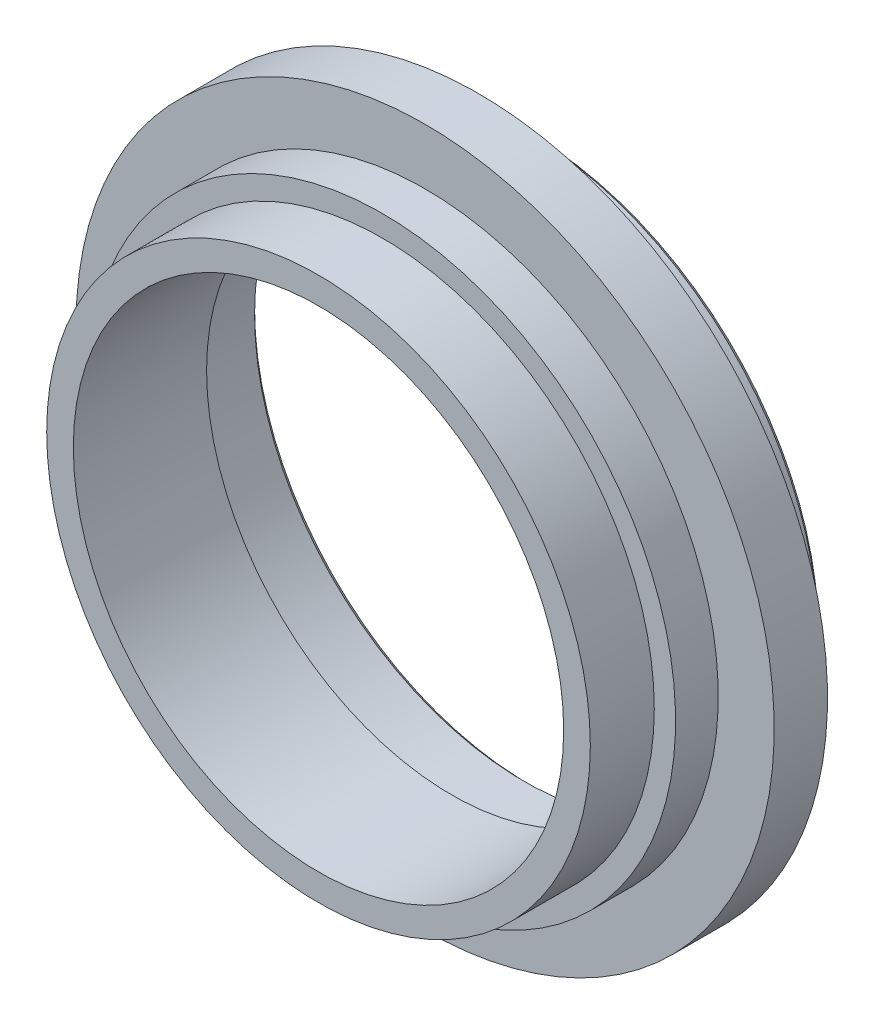
ISO-10303-21;
HEADER;
FILE_DESCRIPTION(('STEP AP214'),'2;1');
FILE_NAME('part.step','',(''),(''),'','','');
FILE_SCHEMA(('AUTOMOTIVE_DESIGN { 1 0 10303 214 1 1 1 1 }'));
ENDSEC;
DATA;
#1=APPLICATION_CONTEXT('core data for automotive mechanical design processes');
#2=APPLICATION_PROTOCOL_DEFINITION('international standard','automotive_design',2000,#1);
#3=PRODUCT_CONTEXT('',#1,'mechanical');
#4=PRODUCT('Part','Part','',(#3));
#5=PRODUCT_RELATED_PRODUCT_CATEGORY('part','',(#4));
#6=PRODUCT_DEFINITION_FORMATION('','',#4);
#7=PRODUCT_DEFINITION_CONTEXT('part definition',#1,'design');
#8=PRODUCT_DEFINITION('design','',#6,#7);
#9=PRODUCT_DEFINITION_SHAPE('','',#8);
#10=(LENGTH_UNIT() NAMED_UNIT(*) SI_UNIT(.MILLI.,.METRE.));
#11=(NAMED_UNIT(*) PLANE_ANGLE_UNIT() SI_UNIT($,.RADIAN.));
#12=(NAMED_UNIT(*) SI_UNIT($,.STERADIAN.) SOLID_ANGLE_UNIT());
#13=UNCERTAINTY_MEASURE_WITH_UNIT(LENGTH_MEASURE(1.E-05),#10,'distance_accuracy_value','');
#14=(GEOMETRIC_REPRESENTATION_CONTEXT(3) GLOBAL_UNCERTAINTY_ASSIGNED_CONTEXT((#13)) GLOBAL_UNIT_ASSIGNED_CONTEXT((#10,
#11,#12)) REPRESENTATION_CONTEXT('',''));
#15=CARTESIAN_POINT('',(0.,0.,0.));
#16=DIRECTION('',(0.,0.,1.));
#17=DIRECTION('',(1.,0.,0.));
#18=AXIS2_PLACEMENT_3D('',#15,#16,#17);
#19=CARTESIAN_POINT('',(0.,0.,-99.29791666667));
#20=DIRECTION('',(0.,0.,-1.));
#21=DIRECTION('',(-1.,0.,0.));
#22=AXIS2_PLACEMENT_3D('',#19,#20,#21);
#23=CYLINDRICAL_SURFACE('',#22,25.3);
#24=CARTESIAN_POINT('',(0.,0.,-19.3));
#25=DIRECTION('',(0.,0.,1.));
#26=DIRECTION('',(1.,0.,0.));
#27=AXIS2_PLACEMENT_3D('',#24,#25,#26);
#28=CIRCLE('',#27,25.3);
#29=CARTESIAN_POINT('',(25.3,0.,-19.3));
#30=VERTEX_POINT('',#29);
#31=EDGE_CURVE('E10',#30,#30,#28,.F.);
#32=ORIENTED_EDGE('',*,*,#31,.T.);
#33=EDGE_LOOP('',(#32));
#34=FACE_BOUND('',#33,.T.);
#35=CARTESIAN_POINT('',(0.,0.,-12.5));
#36=DIRECTION('',(0.,0.,-1.));
#37=DIRECTION('',(-1.,0.,0.));
#38=AXIS2_PLACEMENT_3D('',#35,#36,#37);
#39=CIRCLE('',#38,25.3);
#40=CARTESIAN_POINT('',(-25.3,0.,-12.5));
#41=VERTEX_POINT('',#40);
#42=EDGE_CURVE('E84',#41,#41,#39,.T.);
#43=ORIENTED_EDGE('',*,*,#42,.F.);
#44=EDGE_LOOP('',(#43));
#45=FACE_BOUND('',#44,.T.);
#46=ADVANCED_FACE('F37',(#34,#45),#23,.F.);
#47=CARTESIAN_POINT('',(25.3,0.,-19.8));
#48=DIRECTION('',(0.,0.,1.));
#49=DIRECTION('',(1.,0.,0.));
#50=AXIS2_PLACEMENT_3D('',#47,#48,#49);
#51=PLANE('',#50);
#52=CARTESIAN_POINT('',(0.,0.,-19.8));
#53=DIRECTION('',(0.,0.,1.));
#54=DIRECTION('',(1.,0.,0.));
#55=AXIS2_PLACEMENT_3D('',#52,#53,#54);
#56=CIRCLE('',#55,27.1);
#57=CARTESIAN_POINT('',(27.1,0.,-19.8));
#58=VERTEX_POINT('',#57);
#59=EDGE_CURVE('E48',#58,#58,#56,.F.);
#60=ORIENTED_EDGE('',*,*,#59,.T.);
#61=EDGE_LOOP('',(#60));
#62=FACE_BOUND('',#61,.T.);
#63=CARTESIAN_POINT('',(0.,0.,-19.8));
#64=DIRECTION('',(0.,0.,1.));
#65=DIRECTION('',(1.,0.,0.));
#66=AXIS2_PLACEMENT_3D('',#63,#64,#65);
#67=CIRCLE('',#66,25.8);
#68=CARTESIAN_POINT('',(25.8,0.,-19.8));
#69=VERTEX_POINT('',#68);
#70=EDGE_CURVE('E52',#69,#69,#67,.T.);
#71=ORIENTED_EDGE('',*,*,#70,.T.);
#72=EDGE_LOOP('',(#71));
#73=FACE_BOUND('',#72,.T.);
#74=ADVANCED_FACE('F91',(#62,#73),#51,.F.);
#75=CARTESIAN_POINT('',(0.,0.,-99.29791666667));
#76=DIRECTION('',(0.,0.,-1.));
#77=DIRECTION('',(-1.,0.,0.));
#78=AXIS2_PLACEMENT_3D('',#75,#76,#77);
#79=CYLINDRICAL_SURFACE('',#78,27.6);
#80=CARTESIAN_POINT('',(0.,0.,-19.3));
#81=DIRECTION('',(0.,0.,1.));
#82=DIRECTION('',(1.,0.,0.));
#83=AXIS2_PLACEMENT_3D('',#80,#81,#82);
#84=CIRCLE('',#83,27.6);
#85=CARTESIAN_POINT('',(27.6,0.,-19.3));
#86=VERTEX_POINT('',#85);
#87=EDGE_CURVE('E44',#86,#86,#84,.T.);
#88=ORIENTED_EDGE('',*,*,#87,.T.);
#89=EDGE_LOOP('',(#88));
#90=FACE_BOUND('',#89,.T.);
#91=CARTESIAN_POINT('',(0.,0.,-15.));
#92=DIRECTION('',(0.,0.,-1.));
#93=DIRECTION('',(-1.,0.,0.));
#94=AXIS2_PLACEMENT_3D('',#91,#92,#93);
#95=CIRCLE('',#94,27.6);
#96=CARTESIAN_POINT('',(-27.6,0.,-15.));
#97=VERTEX_POINT('',#96);
#98=EDGE_CURVE('E57',#97,#97,#95,.T.);
#99=ORIENTED_EDGE('',*,*,#98,.T.);
#100=EDGE_LOOP('',(#99));
#101=FACE_BOUND('',#100,.T.);
#102=ADVANCED_FACE('F96',(#90,#101),#79,.T.);
#103=CARTESIAN_POINT('',(27.6,0.,-15.));
#104=DIRECTION('',(0.,0.,1.));
#105=DIRECTION('',(1.,0.,0.));
#106=AXIS2_PLACEMENT_3D('',#103,#104,#105);
#107=PLANE('',#106);
#108=ORIENTED_EDGE('',*,*,#98,.F.);
#109=EDGE_LOOP('',(#108));
#110=FACE_BOUND('',#109,.T.);
#111=CARTESIAN_POINT('',(0.,0.,-15.));
#112=DIRECTION('',(0.,0.,-1.));
#113=DIRECTION('',(-1.,0.,0.));
#114=AXIS2_PLACEMENT_3D('',#111,#112,#113);
#115=CIRCLE('',#114,32.75);
#116=CARTESIAN_POINT('',(-32.75,0.,-15.));
#117=VERTEX_POINT('',#116);
#118=EDGE_CURVE('E60',#117,#117,#115,.T.);
#119=ORIENTED_EDGE('',*,*,#118,.T.);
#120=EDGE_LOOP('',(#119));
#121=FACE_BOUND('',#120,.T.);
#122=ADVANCED_FACE('F146',(#110,#121),#107,.F.);
#123=CARTESIAN_POINT('',(0.,0.,-99.29791666667));
#124=DIRECTION('',(0.,0.,-1.));
#125=DIRECTION('',(-1.,0.,0.));
#126=AXIS2_PLACEMENT_3D('',#123,#124,#125);
#127=CYLINDRICAL_SURFACE('',#126,32.75);
#128=ORIENTED_EDGE('',*,*,#118,.F.);
#129=EDGE_LOOP('',(#128));
#130=FACE_BOUND('',#129,.T.);
#131=CARTESIAN_POINT('',(0.,0.,-10.));
#132=DIRECTION('',(0.,0.,-1.));
#133=DIRECTION('',(-1.,0.,0.));
#134=AXIS2_PLACEMENT_3D('',#131,#132,#133);
#135=CIRCLE('',#134,32.75);
#136=CARTESIAN_POINT('',(-32.75,0.,-10.));
#137=VERTEX_POINT('',#136);
#138=EDGE_CURVE('E63',#137,#137,#135,.T.);
#139=ORIENTED_EDGE('',*,*,#138,.T.);
#140=EDGE_LOOP('',(#139));
#141=FACE_BOUND('',#140,.T.);
#142=ADVANCED_FACE('F142',(#130,#141),#127,.T.);
#143=CARTESIAN_POINT('',(32.75,0.,-10.));
#144=DIRECTION('',(0.,0.,-1.));
#145=DIRECTION('',(-1.,0.,0.));
#146=AXIS2_PLACEMENT_3D('',#143,#144,#145);
#147=PLANE('',#146);
#148=ORIENTED_EDGE('',*,*,#138,.F.);
#149=EDGE_LOOP('',(#148));
#150=FACE_BOUND('',#149,.T.);
#151=CARTESIAN_POINT('',(0.,0.,-9.99999999999999));
#152=DIRECTION('',(0.,0.,-1.));
#153=DIRECTION('',(-1.,0.,0.));
#154=AXIS2_PLACEMENT_3D('',#151,#152,#153);
#155=CIRCLE('',#154,27.5);
#156=CARTESIAN_POINT('',(-27.5,0.,-9.99999999999999));
#157=VERTEX_POINT('',#156);
#158=EDGE_CURVE('E66',#157,#157,#155,.T.);
#159=ORIENTED_EDGE('',*,*,#158,.T.);
#160=EDGE_LOOP('',(#159));
#161=FACE_BOUND('',#160,.T.);
#162=ADVANCED_FACE('F138',(#150,#161),#147,.F.);
#163=CARTESIAN_POINT('',(0.,0.,-99.29791666667));
#164=DIRECTION('',(0.,0.,-1.));
#165=DIRECTION('',(-1.,0.,0.));
#166=AXIS2_PLACEMENT_3D('',#163,#164,#165);
#167=CYLINDRICAL_SURFACE('',#166,27.5);
#168=ORIENTED_EDGE('',*,*,#158,.F.);
#169=EDGE_LOOP('',(#168));
#170=FACE_BOUND('',#169,.T.);
#171=CARTESIAN_POINT('',(0.,0.,-6.00000000000002));
#172=DIRECTION('',(0.,0.,-1.));
#173=DIRECTION('',(-1.,0.,0.));
#174=AXIS2_PLACEMENT_3D('',#171,#172,#173);
#175=CIRCLE('',#174,27.5);
#176=CARTESIAN_POINT('',(-27.5,0.,-6.00000000000002));
#177=VERTEX_POINT('',#176);
#178=EDGE_CURVE('E69',#177,#177,#175,.T.);
#179=ORIENTED_EDGE('',*,*,#178,.T.);
#180=EDGE_LOOP('',(#179));
#181=FACE_BOUND('',#180,.T.);
#182=ADVANCED_FACE('F134',(#170,#181),#167,.T.);
#183=CARTESIAN_POINT('',(25.5,0.,-6.00000000000002));
#184=DIRECTION('',(0.,0.,-1.));
#185=DIRECTION('',(-1.,0.,0.));
#186=AXIS2_PLACEMENT_3D('',#183,#184,#185);
#187=PLANE('',#186);
#188=ORIENTED_EDGE('',*,*,#178,.F.);
#189=EDGE_LOOP('',(#188));
#190=FACE_BOUND('',#189,.T.);
#191=CARTESIAN_POINT('',(0.,0.,-6.00000000000002));
#192=DIRECTION('',(0.,0.,-1.));
#193=DIRECTION('',(-1.,0.,0.));
#194=AXIS2_PLACEMENT_3D('',#191,#192,#193);
#195=CIRCLE('',#194,25.5);
#196=CARTESIAN_POINT('',(-25.5,0.,-6.00000000000002));
#197=VERTEX_POINT('',#196);
#198=EDGE_CURVE('E72',#197,#197,#195,.T.);
#199=ORIENTED_EDGE('',*,*,#198,.T.);
#200=EDGE_LOOP('',(#199));
#201=FACE_BOUND('',#200,.T.);
#202=ADVANCED_FACE('F130',(#190,#201),#187,.F.);
#203=CARTESIAN_POINT('',(0.,0.,-99.29791666667));
#204=DIRECTION('',(0.,0.,-1.));
#205=DIRECTION('',(-1.,0.,0.));
#206=AXIS2_PLACEMENT_3D('',#203,#204,#205);
#207=CYLINDRICAL_SURFACE('',#206,25.5);
#208=ORIENTED_EDGE('',*,*,#198,.F.);
#209=EDGE_LOOP('',(#208));
#210=FACE_BOUND('',#209,.T.);
#211=CARTESIAN_POINT('',(0.,0.,0.));
#212=DIRECTION('',(0.,0.,-1.));
#213=DIRECTION('',(-1.,0.,0.));
#214=AXIS2_PLACEMENT_3D('',#211,#212,#213);
#215=CIRCLE('',#214,25.5);
#216=CARTESIAN_POINT('',(-25.5,0.,0.));
#217=VERTEX_POINT('',#216);
#218=EDGE_CURVE('E75',#217,#217,#215,.T.);
#219=ORIENTED_EDGE('',*,*,#218,.T.);
#220=EDGE_LOOP('',(#219));
#221=FACE_BOUND('',#220,.T.);
#222=ADVANCED_FACE('F126',(#210,#221),#207,.T.);
#223=CARTESIAN_POINT('',(25.5,0.,0.));
#224=DIRECTION('',(0.,0.,-1.));
#225=DIRECTION('',(-1.,0.,0.));
#226=AXIS2_PLACEMENT_3D('',#223,#224,#225);
#227=PLANE('',#226);
#228=ORIENTED_EDGE('',*,*,#218,.F.);
#229=EDGE_LOOP('',(#228));
#230=FACE_BOUND('',#229,.T.);
#231=CARTESIAN_POINT('',(0.,0.,0.));
#232=DIRECTION('',(0.,0.,-1.));
#233=DIRECTION('',(-1.,0.,0.));
#234=AXIS2_PLACEMENT_3D('',#231,#232,#233);
#235=CIRCLE('',#234,23.);
#236=CARTESIAN_POINT('',(-23.,0.,0.));
#237=VERTEX_POINT('',#236);
#238=EDGE_CURVE('E78',#237,#237,#235,.T.);
#239=ORIENTED_EDGE('',*,*,#238,.T.);
#240=EDGE_LOOP('',(#239));
#241=FACE_BOUND('',#240,.T.);
#242=ADVANCED_FACE('F119',(#230,#241),#227,.F.);
#243=CARTESIAN_POINT('',(0.,0.,-99.29791666667));
#244=DIRECTION('',(0.,0.,-1.));
#245=DIRECTION('',(-1.,0.,0.));
#246=AXIS2_PLACEMENT_3D('',#243,#244,#245);
#247=CYLINDRICAL_SURFACE('',#246,23.);
#248=ORIENTED_EDGE('',*,*,#238,.F.);
#249=EDGE_LOOP('',(#248));
#250=FACE_BOUND('',#249,.T.);
#251=CARTESIAN_POINT('',(0.,0.,-12.5));
#252=DIRECTION('',(0.,0.,-1.));
#253=DIRECTION('',(-1.,0.,0.));
#254=AXIS2_PLACEMENT_3D('',#251,#252,#253);
#255=CIRCLE('',#254,23.);
#256=CARTESIAN_POINT('',(-23.,0.,-12.5));
#257=VERTEX_POINT('',#256);
#258=EDGE_CURVE('E81',#257,#257,#255,.T.);
#259=ORIENTED_EDGE('',*,*,#258,.T.);
#260=EDGE_LOOP('',(#259));
#261=FACE_BOUND('',#260,.T.);
#262=ADVANCED_FACE('F108',(#250,#261),#247,.F.);
#263=CARTESIAN_POINT('',(25.3,0.,-12.5));
#264=DIRECTION('',(0.,0.,1.));
#265=DIRECTION('',(1.,0.,0.));
#266=AXIS2_PLACEMENT_3D('',#263,#264,#265);
#267=PLANE('',#266);
#268=ORIENTED_EDGE('',*,*,#258,.F.);
#269=EDGE_LOOP('',(#268));
#270=FACE_BOUND('',#269,.T.);
#271=ORIENTED_EDGE('',*,*,#42,.T.);
#272=EDGE_LOOP('',(#271));
#273=FACE_BOUND('',#272,.T.);
#274=ADVANCED_FACE('F88',(#270,#273),#267,.F.);
#275=CARTESIAN_POINT('',(0.,0.,-19.8));
#276=DIRECTION('',(0.,0.,1.));
#277=DIRECTION('',(1.,0.,0.));
#278=AXIS2_PLACEMENT_3D('',#275,#276,#277);
#279=CONICAL_SURFACE('',#278,27.1,0.785398163397445);
#280=ORIENTED_EDGE('',*,*,#87,.F.);
#281=EDGE_LOOP('',(#280));
#282=FACE_BOUND('',#281,.T.);
#283=ORIENTED_EDGE('',*,*,#59,.F.);
#284=EDGE_LOOP('',(#283));
#285=FACE_BOUND('',#284,.T.);
#286=ADVANCED_FACE('F100',(#282,#285),#279,.T.);
#287=CARTESIAN_POINT('',(0.,0.,-19.3));
#288=DIRECTION('',(0.,0.,-1.));
#289=DIRECTION('',(-1.,0.,0.));
#290=AXIS2_PLACEMENT_3D('',#287,#288,#289);
#291=CONICAL_SURFACE('',#290,25.3,0.785398163397459);
#292=ORIENTED_EDGE('',*,*,#70,.F.);
#293=EDGE_LOOP('',(#292));
#294=FACE_BOUND('',#293,.T.);
#295=ORIENTED_EDGE('',*,*,#31,.F.);
#296=EDGE_LOOP('',(#295));
#297=FACE_BOUND('',#296,.T.);
#298=ADVANCED_FACE('F39',(#294,#297),#291,.F.);
#299=CLOSED_SHELL('',(#46,#74,#102,#122,#142,#162,#182,#202,#222,#242,#262,#274,#286,#298));
#300=MANIFOLD_SOLID_BREP('B2',#299);
#301=ADVANCED_BREP_SHAPE_REPRESENTATION('',(#18,#300),#14);
#302=SHAPE_DEFINITION_REPRESENTATION(#9,#301);
ENDSEC;
END-ISO-10303-21;
